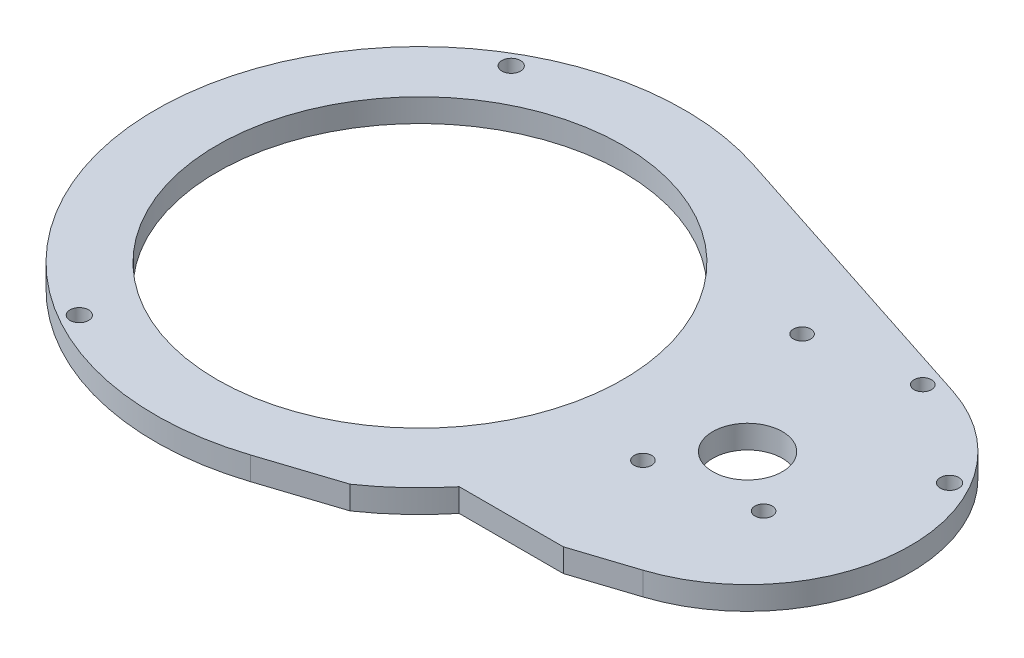
ISO-10303-21;
HEADER;
FILE_DESCRIPTION(('STEP AP214'),'2;1');
FILE_NAME('part.step','',(''),(''),'','','');
FILE_SCHEMA(('AUTOMOTIVE_DESIGN { 1 0 10303 214 1 1 1 1 }'));
ENDSEC;
DATA;
#1=APPLICATION_CONTEXT('core data for automotive mechanical design processes');
#2=APPLICATION_PROTOCOL_DEFINITION('international standard','automotive_design',2000,#1);
#3=PRODUCT_CONTEXT('',#1,'mechanical');
#4=PRODUCT('Part','Part','',(#3));
#5=PRODUCT_RELATED_PRODUCT_CATEGORY('part','',(#4));
#6=PRODUCT_DEFINITION_FORMATION('','',#4);
#7=PRODUCT_DEFINITION_CONTEXT('part definition',#1,'design');
#8=PRODUCT_DEFINITION('design','',#6,#7);
#9=PRODUCT_DEFINITION_SHAPE('','',#8);
#10=(LENGTH_UNIT() NAMED_UNIT(*) SI_UNIT(.MILLI.,.METRE.));
#11=(NAMED_UNIT(*) PLANE_ANGLE_UNIT() SI_UNIT($,.RADIAN.));
#12=(NAMED_UNIT(*) SI_UNIT($,.STERADIAN.) SOLID_ANGLE_UNIT());
#13=UNCERTAINTY_MEASURE_WITH_UNIT(LENGTH_MEASURE(1.E-05),#10,'distance_accuracy_value','');
#14=(GEOMETRIC_REPRESENTATION_CONTEXT(3) GLOBAL_UNCERTAINTY_ASSIGNED_CONTEXT((#13)) GLOBAL_UNIT_ASSIGNED_CONTEXT((#10,
#11,#12)) REPRESENTATION_CONTEXT('',''));
#15=CARTESIAN_POINT('',(0.,0.,0.));
#16=DIRECTION('',(0.,0.,1.));
#17=DIRECTION('',(1.,0.,0.));
#18=AXIS2_PLACEMENT_3D('',#15,#16,#17);
#19=CARTESIAN_POINT('',(14.1238938053097,4.,43.3575324917866));
#20=DIRECTION('',(-0.309734513274336,0.,-0.950823080960233));
#21=DIRECTION('',(-0.950823080960233,0.,0.309734513274336));
#22=AXIS2_PLACEMENT_3D('',#19,#20,#21);
#23=PLANE('',#22);
#24=DIRECTION('',(0.950823080960233,0.,-0.309734513274336));
#25=VECTOR('',#24,1.);
#26=CARTESIAN_POINT('',(14.1238938053097,0.,43.3575324917866));
#27=LINE('',#26,#25);
#28=CARTESIAN_POINT('',(54.8218701351415,0.,30.1));
#29=VERTEX_POINT('',#28);
#30=CARTESIAN_POINT('',(65.2035398230089,0.,26.7181285749825));
#31=VERTEX_POINT('',#30);
#32=EDGE_CURVE('E135',#29,#31,#27,.T.);
#33=ORIENTED_EDGE('',*,*,#32,.T.);
#34=DIRECTION('',(0.,-1.,0.));
#35=VECTOR('',#34,1.);
#36=CARTESIAN_POINT('',(65.2035398230089,4.,26.7181285749825));
#37=LINE('',#36,#35);
#38=CARTESIAN_POINT('',(65.2035398230089,4.,26.7181285749825));
#39=VERTEX_POINT('',#38);
#40=EDGE_CURVE('E11',#39,#31,#37,.T.);
#41=ORIENTED_EDGE('',*,*,#40,.F.);
#42=DIRECTION('',(0.950823080960233,0.,-0.309734513274336));
#43=VECTOR('',#42,1.);
#44=CARTESIAN_POINT('',(14.1238938053097,4.,43.3575324917866));
#45=LINE('',#44,#43);
#46=CARTESIAN_POINT('',(54.8218701351415,4.,30.1));
#47=VERTEX_POINT('',#46);
#48=EDGE_CURVE('E120',#47,#39,#45,.T.);
#49=ORIENTED_EDGE('',*,*,#48,.F.);
#50=DIRECTION('',(0.,-1.,0.));
#51=VECTOR('',#50,1.);
#52=CARTESIAN_POINT('',(54.8218701351415,4.,30.1));
#53=LINE('',#52,#51);
#54=EDGE_CURVE('E130',#47,#29,#53,.T.);
#55=ORIENTED_EDGE('',*,*,#54,.T.);
#56=EDGE_LOOP('',(#33,#41,#49,#55));
#57=FACE_BOUND('',#56,.T.);
#58=ADVANCED_FACE('F39',(#57),#23,.F.);
#59=CARTESIAN_POINT('',(56.5,4.,0.));
#60=DIRECTION('',(0.,-1.,0.));
#61=DIRECTION('',(0.,0.,-1.));
#62=AXIS2_PLACEMENT_3D('',#59,#60,#61);
#63=CYLINDRICAL_SURFACE('',#62,28.1);
#64=CARTESIAN_POINT('',(56.5,0.,0.));
#65=DIRECTION('',(0.,1.,0.));
#66=DIRECTION('',(0.,0.,1.));
#67=AXIS2_PLACEMENT_3D('',#64,#65,#66);
#68=CIRCLE('',#67,28.1);
#69=CARTESIAN_POINT('',(65.2035398230089,0.,-26.7181285749825));
#70=VERTEX_POINT('',#69);
#71=EDGE_CURVE('E138',#31,#70,#68,.T.);
#72=ORIENTED_EDGE('',*,*,#71,.T.);
#73=DIRECTION('',(0.,-1.,0.));
#74=VECTOR('',#73,1.);
#75=CARTESIAN_POINT('',(65.2035398230089,4.,-26.7181285749825));
#76=LINE('',#75,#74);
#77=CARTESIAN_POINT('',(65.2035398230089,4.,-26.7181285749825));
#78=VERTEX_POINT('',#77);
#79=EDGE_CURVE('E49',#78,#70,#76,.T.);
#80=ORIENTED_EDGE('',*,*,#79,.F.);
#81=CARTESIAN_POINT('',(56.5,4.,0.));
#82=DIRECTION('',(0.,1.,0.));
#83=DIRECTION('',(0.,0.,1.));
#84=AXIS2_PLACEMENT_3D('',#81,#82,#83);
#85=CIRCLE('',#84,28.1);
#86=EDGE_CURVE('E98',#39,#78,#85,.T.);
#87=ORIENTED_EDGE('',*,*,#86,.F.);
#88=ORIENTED_EDGE('',*,*,#40,.T.);
#89=EDGE_LOOP('',(#72,#80,#87,#88));
#90=FACE_BOUND('',#89,.T.);
#91=ADVANCED_FACE('F41',(#90),#63,.T.);
#92=CARTESIAN_POINT('',(14.1238938053097,4.,-43.3575324917866));
#93=DIRECTION('',(0.309734513274336,0.,-0.950823080960233));
#94=DIRECTION('',(-0.950823080960233,0.,-0.309734513274336));
#95=AXIS2_PLACEMENT_3D('',#92,#93,#94);
#96=PLANE('',#95);
#97=DIRECTION('',(0.950823080960233,0.,0.309734513274336));
#98=VECTOR('',#97,1.);
#99=CARTESIAN_POINT('',(14.1238938053097,0.,-43.3575324917866));
#100=LINE('',#99,#98);
#101=CARTESIAN_POINT('',(14.1238938053097,0.,-43.3575324917866));
#102=VERTEX_POINT('',#101);
#103=EDGE_CURVE('E142',#102,#70,#100,.T.);
#104=ORIENTED_EDGE('',*,*,#103,.F.);
#105=DIRECTION('',(0.,-1.,0.));
#106=VECTOR('',#105,1.);
#107=CARTESIAN_POINT('',(14.1238938053097,4.,-43.3575324917866));
#108=LINE('',#107,#106);
#109=CARTESIAN_POINT('',(14.1238938053097,4.,-43.3575324917866));
#110=VERTEX_POINT('',#109);
#111=EDGE_CURVE('E152',#110,#102,#108,.T.);
#112=ORIENTED_EDGE('',*,*,#111,.F.);
#113=DIRECTION('',(0.950823080960233,0.,0.309734513274336));
#114=VECTOR('',#113,1.);
#115=CARTESIAN_POINT('',(14.1238938053097,4.,-43.3575324917866));
#116=LINE('',#115,#114);
#117=EDGE_CURVE('E203',#110,#78,#116,.T.);
#118=ORIENTED_EDGE('',*,*,#117,.T.);
#119=ORIENTED_EDGE('',*,*,#79,.T.);
#120=EDGE_LOOP('',(#104,#112,#118,#119));
#121=FACE_BOUND('',#120,.T.);
#122=ADVANCED_FACE('F207',(#121),#96,.T.);
#123=CARTESIAN_POINT('',(0.,4.,0.));
#124=DIRECTION('',(0.,-1.,0.));
#125=DIRECTION('',(0.,0.,-1.));
#126=AXIS2_PLACEMENT_3D('',#123,#124,#125);
#127=CYLINDRICAL_SURFACE('',#126,45.6);
#128=CARTESIAN_POINT('',(0.,0.,0.));
#129=DIRECTION('',(0.,1.,0.));
#130=DIRECTION('',(0.,0.,1.));
#131=AXIS2_PLACEMENT_3D('',#128,#129,#130);
#132=CIRCLE('',#131,45.6);
#133=CARTESIAN_POINT('',(14.1238938053097,0.,43.3575324917866));
#134=VERTEX_POINT('',#133);
#135=EDGE_CURVE('E145',#102,#134,#132,.T.);
#136=ORIENTED_EDGE('',*,*,#135,.T.);
#137=DIRECTION('',(0.,-1.,0.));
#138=VECTOR('',#137,1.);
#139=CARTESIAN_POINT('',(14.1238938053097,4.,43.3575324917866));
#140=LINE('',#139,#138);
#141=CARTESIAN_POINT('',(14.1238938053097,4.,43.3575324917866));
#142=VERTEX_POINT('',#141);
#143=EDGE_CURVE('E125',#142,#134,#140,.T.);
#144=ORIENTED_EDGE('',*,*,#143,.F.);
#145=CARTESIAN_POINT('',(0.,4.,0.));
#146=DIRECTION('',(0.,1.,0.));
#147=DIRECTION('',(0.,0.,1.));
#148=AXIS2_PLACEMENT_3D('',#145,#146,#147);
#149=CIRCLE('',#148,45.6);
#150=EDGE_CURVE('E115',#110,#142,#149,.T.);
#151=ORIENTED_EDGE('',*,*,#150,.F.);
#152=ORIENTED_EDGE('',*,*,#111,.T.);
#153=EDGE_LOOP('',(#136,#144,#151,#152));
#154=FACE_BOUND('',#153,.T.);
#155=ADVANCED_FACE('F215',(#154),#127,.T.);
#156=CARTESIAN_POINT('',(27.105327802825,0.,39.1287771940474));
#157=VERTEX_POINT('',#156);
#158=EDGE_CURVE('E124',#134,#157,#27,.T.);
#159=ORIENTED_EDGE('',*,*,#158,.T.);
#160=DIRECTION('',(0.,-1.,0.));
#161=VECTOR('',#160,1.);
#162=CARTESIAN_POINT('',(27.105327802825,4.,39.1287771940474));
#163=LINE('',#162,#161);
#164=CARTESIAN_POINT('',(27.105327802825,4.,39.1287771940474));
#165=VERTEX_POINT('',#164);
#166=EDGE_CURVE('E121',#165,#157,#163,.T.);
#167=ORIENTED_EDGE('',*,*,#166,.F.);
#168=EDGE_CURVE('E108',#142,#165,#45,.T.);
#169=ORIENTED_EDGE('',*,*,#168,.F.);
#170=ORIENTED_EDGE('',*,*,#143,.T.);
#171=EDGE_LOOP('',(#159,#167,#169,#170));
#172=FACE_BOUND('',#171,.T.);
#173=ADVANCED_FACE('F122',(#172),#23,.F.);
#174=CARTESIAN_POINT('',(0.,4.,0.));
#175=DIRECTION('',(0.,-1.,0.));
#176=DIRECTION('',(0.,0.,-1.));
#177=AXIS2_PLACEMENT_3D('',#174,#175,#176);
#178=CYLINDRICAL_SURFACE('',#177,47.6);
#179=CARTESIAN_POINT('',(0.,0.,0.));
#180=DIRECTION('',(0.,1.,0.));
#181=DIRECTION('',(0.,0.,1.));
#182=AXIS2_PLACEMENT_3D('',#179,#180,#181);
#183=CIRCLE('',#182,47.6);
#184=CARTESIAN_POINT('',(36.8747881349846,0.,30.1));
#185=VERTEX_POINT('',#184);
#186=EDGE_CURVE('E84',#157,#185,#183,.T.);
#187=ORIENTED_EDGE('',*,*,#186,.T.);
#188=DIRECTION('',(0.,-1.,0.));
#189=VECTOR('',#188,1.);
#190=CARTESIAN_POINT('',(36.8747881349846,4.,30.1));
#191=LINE('',#190,#189);
#192=CARTESIAN_POINT('',(36.8747881349846,4.,30.1));
#193=VERTEX_POINT('',#192);
#194=EDGE_CURVE('E126',#193,#185,#191,.T.);
#195=ORIENTED_EDGE('',*,*,#194,.F.);
#196=CARTESIAN_POINT('',(0.,4.,0.));
#197=DIRECTION('',(0.,1.,0.));
#198=DIRECTION('',(0.,0.,1.));
#199=AXIS2_PLACEMENT_3D('',#196,#197,#198);
#200=CIRCLE('',#199,47.6);
#201=EDGE_CURVE('E112',#165,#193,#200,.T.);
#202=ORIENTED_EDGE('',*,*,#201,.F.);
#203=ORIENTED_EDGE('',*,*,#166,.T.);
#204=EDGE_LOOP('',(#187,#195,#202,#203));
#205=FACE_BOUND('',#204,.T.);
#206=ADVANCED_FACE('F128',(#205),#178,.T.);
#207=CARTESIAN_POINT('',(0.,4.,30.1));
#208=DIRECTION('',(0.,0.,-1.));
#209=DIRECTION('',(-1.,0.,0.));
#210=AXIS2_PLACEMENT_3D('',#207,#208,#209);
#211=PLANE('',#210);
#212=DIRECTION('',(1.,0.,0.));
#213=VECTOR('',#212,1.);
#214=CARTESIAN_POINT('',(0.,0.,30.1));
#215=LINE('',#214,#213);
#216=EDGE_CURVE('E90',#185,#29,#215,.T.);
#217=ORIENTED_EDGE('',*,*,#216,.T.);
#218=ORIENTED_EDGE('',*,*,#54,.F.);
#219=DIRECTION('',(1.,0.,0.));
#220=VECTOR('',#219,1.);
#221=CARTESIAN_POINT('',(0.,4.,30.1));
#222=LINE('',#221,#220);
#223=EDGE_CURVE('E58',#193,#47,#222,.T.);
#224=ORIENTED_EDGE('',*,*,#223,.F.);
#225=ORIENTED_EDGE('',*,*,#194,.T.);
#226=EDGE_LOOP('',(#217,#218,#224,#225));
#227=FACE_BOUND('',#226,.T.);
#228=ADVANCED_FACE('F231',(#227),#211,.F.);
#229=CARTESIAN_POINT('',(0.,4.,0.));
#230=DIRECTION('',(0.,1.,0.));
#231=DIRECTION('',(0.,0.,1.));
#232=AXIS2_PLACEMENT_3D('',#229,#230,#231);
#233=PLANE('',#232);
#234=CARTESIAN_POINT('',(66.758977016517,4.,7.49195017677568));
#235=DIRECTION('',(0.,1.,0.));
#236=DIRECTION('',(0.,0.,1.));
#237=AXIS2_PLACEMENT_3D('',#234,#235,#236);
#238=CIRCLE('',#237,1.5);
#239=CARTESIAN_POINT('',(66.758977016517,4.,8.99195017677568));
#240=VERTEX_POINT('',#239);
#241=EDGE_CURVE('E177',#240,#240,#238,.T.);
#242=ORIENTED_EDGE('',*,*,#241,.F.);
#243=EDGE_LOOP('',(#242));
#244=FACE_BOUND('',#243,.T.);
#245=CARTESIAN_POINT('',(48.7816000672357,4.,10.3298927455128));
#246=DIRECTION('',(0.,1.,0.));
#247=DIRECTION('',(0.,0.,1.));
#248=AXIS2_PLACEMENT_3D('',#245,#246,#247);
#249=CIRCLE('',#248,1.5);
#250=CARTESIAN_POINT('',(48.7816000672357,4.,11.8298927455129));
#251=VERTEX_POINT('',#250);
#252=EDGE_CURVE('E278',#251,#251,#249,.T.);
#253=ORIENTED_EDGE('',*,*,#252,.F.);
#254=EDGE_LOOP('',(#253));
#255=FACE_BOUND('',#254,.T.);
#256=CARTESIAN_POINT('',(61.6132569743012,4.,-25.1043926433497));
#257=DIRECTION('',(0.,1.,0.));
#258=DIRECTION('',(0.,0.,1.));
#259=AXIS2_PLACEMENT_3D('',#256,#257,#258);
#260=CIRCLE('',#259,1.49999999999999);
#261=CARTESIAN_POINT('',(61.6132569743012,4.,-23.6043926433497));
#262=VERTEX_POINT('',#261);
#263=EDGE_CURVE('E281',#262,#262,#260,.T.);
#264=ORIENTED_EDGE('',*,*,#263,.F.);
#265=EDGE_LOOP('',(#264));
#266=FACE_BOUND('',#265,.T.);
#267=CARTESIAN_POINT('',(43.63588002502,4.,-22.2664500746125));
#268=DIRECTION('',(0.,1.,0.));
#269=DIRECTION('',(0.,0.,1.));
#270=AXIS2_PLACEMENT_3D('',#267,#268,#269);
#271=CIRCLE('',#270,1.5);
#272=CARTESIAN_POINT('',(43.63588002502,4.,-20.7664500746125));
#273=VERTEX_POINT('',#272);
#274=EDGE_CURVE('E192',#273,#273,#271,.T.);
#275=ORIENTED_EDGE('',*,*,#274,.F.);
#276=EDGE_LOOP('',(#275));
#277=FACE_BOUND('',#276,.T.);
#278=CARTESIAN_POINT('',(0.,4.,0.));
#279=DIRECTION('',(0.,1.,0.));
#280=DIRECTION('',(0.,0.,1.));
#281=AXIS2_PLACEMENT_3D('',#278,#279,#280);
#282=CIRCLE('',#281,35.);
#283=CARTESIAN_POINT('',(0.,4.,35.));
#284=VERTEX_POINT('',#283);
#285=EDGE_CURVE('E172',#284,#284,#282,.T.);
#286=ORIENTED_EDGE('',*,*,#285,.F.);
#287=EDGE_LOOP('',(#286));
#288=FACE_BOUND('',#287,.T.);
#289=CARTESIAN_POINT('',(78.5836477965031,4.,-12.7500000000001));
#290=DIRECTION('',(0.,1.,0.));
#291=DIRECTION('',(0.,0.,1.));
#292=AXIS2_PLACEMENT_3D('',#289,#290,#291);
#293=CIRCLE('',#292,1.6);
#294=CARTESIAN_POINT('',(78.5836477965031,4.,-11.1500000000001));
#295=VERTEX_POINT('',#294);
#296=EDGE_CURVE('E162',#295,#295,#293,.T.);
#297=ORIENTED_EDGE('',*,*,#296,.F.);
#298=EDGE_LOOP('',(#297));
#299=FACE_BOUND('',#298,.T.);
#300=CARTESIAN_POINT('',(-21.5000000000001,4.,-37.2390923627309));
#301=DIRECTION('',(0.,1.,0.));
#302=DIRECTION('',(0.,0.,1.));
#303=AXIS2_PLACEMENT_3D('',#300,#301,#302);
#304=CIRCLE('',#303,1.6);
#305=CARTESIAN_POINT('',(-21.5000000000001,4.,-35.6390923627309));
#306=VERTEX_POINT('',#305);
#307=EDGE_CURVE('E196',#306,#306,#304,.T.);
#308=ORIENTED_EDGE('',*,*,#307,.F.);
#309=EDGE_LOOP('',(#308));
#310=FACE_BOUND('',#309,.T.);
#311=CARTESIAN_POINT('',(-21.4999999999999,4.,37.2390923627309));
#312=DIRECTION('',(0.,1.,0.));
#313=DIRECTION('',(0.,0.,1.));
#314=AXIS2_PLACEMENT_3D('',#311,#312,#313);
#315=CIRCLE('',#314,1.60000000000001);
#316=CARTESIAN_POINT('',(-21.4999999999999,4.,38.8390923627309));
#317=VERTEX_POINT('',#316);
#318=EDGE_CURVE('E171',#317,#317,#315,.T.);
#319=ORIENTED_EDGE('',*,*,#318,.F.);
#320=EDGE_LOOP('',(#319));
#321=FACE_BOUND('',#320,.T.);
#322=CARTESIAN_POINT('',(56.5,4.,0.));
#323=DIRECTION('',(0.,1.,0.));
#324=DIRECTION('',(0.,0.,1.));
#325=AXIS2_PLACEMENT_3D('',#322,#323,#324);
#326=CIRCLE('',#325,6.00000000000005);
#327=CARTESIAN_POINT('',(56.5,4.,6.00000000000007));
#328=VERTEX_POINT('',#327);
#329=EDGE_CURVE('E157',#328,#328,#326,.T.);
#330=ORIENTED_EDGE('',*,*,#329,.F.);
#331=EDGE_LOOP('',(#330));
#332=FACE_BOUND('',#331,.T.);
#333=ORIENTED_EDGE('',*,*,#48,.T.);
#334=ORIENTED_EDGE('',*,*,#86,.T.);
#335=ORIENTED_EDGE('',*,*,#117,.F.);
#336=ORIENTED_EDGE('',*,*,#150,.T.);
#337=ORIENTED_EDGE('',*,*,#168,.T.);
#338=ORIENTED_EDGE('',*,*,#201,.T.);
#339=ORIENTED_EDGE('',*,*,#223,.T.);
#340=EDGE_LOOP('',(#333,#334,#335,#336,#337,#338,#339));
#341=FACE_BOUND('',#340,.T.);
#342=ADVANCED_FACE('F110',(#244,#255,#266,#277,#288,#299,#310,#321,#332,#341),#233,.T.);
#343=CARTESIAN_POINT('',(0.,0.,0.));
#344=DIRECTION('',(0.,1.,0.));
#345=DIRECTION('',(0.,0.,1.));
#346=AXIS2_PLACEMENT_3D('',#343,#344,#345);
#347=PLANE('',#346);
#348=CARTESIAN_POINT('',(66.758977016517,0.,7.49195017677568));
#349=DIRECTION('',(0.,1.,0.));
#350=DIRECTION('',(0.,0.,1.));
#351=AXIS2_PLACEMENT_3D('',#348,#349,#350);
#352=CIRCLE('',#351,1.5);
#353=CARTESIAN_POINT('',(66.758977016517,0.,8.99195017677568));
#354=VERTEX_POINT('',#353);
#355=EDGE_CURVE('E43',#354,#354,#352,.T.);
#356=ORIENTED_EDGE('',*,*,#355,.T.);
#357=EDGE_LOOP('',(#356));
#358=FACE_BOUND('',#357,.T.);
#359=CARTESIAN_POINT('',(48.7816000672357,0.,10.3298927455128));
#360=DIRECTION('',(0.,1.,0.));
#361=DIRECTION('',(0.,0.,1.));
#362=AXIS2_PLACEMENT_3D('',#359,#360,#361);
#363=CIRCLE('',#362,1.5);
#364=CARTESIAN_POINT('',(48.7816000672357,0.,11.8298927455129));
#365=VERTEX_POINT('',#364);
#366=EDGE_CURVE('E179',#365,#365,#363,.T.);
#367=ORIENTED_EDGE('',*,*,#366,.T.);
#368=EDGE_LOOP('',(#367));
#369=FACE_BOUND('',#368,.T.);
#370=CARTESIAN_POINT('',(61.6132569743012,0.,-25.1043926433497));
#371=DIRECTION('',(0.,1.,0.));
#372=DIRECTION('',(0.,0.,1.));
#373=AXIS2_PLACEMENT_3D('',#370,#371,#372);
#374=CIRCLE('',#373,1.49999999999999);
#375=CARTESIAN_POINT('',(61.6132569743012,0.,-23.6043926433497));
#376=VERTEX_POINT('',#375);
#377=EDGE_CURVE('E176',#376,#376,#374,.T.);
#378=ORIENTED_EDGE('',*,*,#377,.T.);
#379=EDGE_LOOP('',(#378));
#380=FACE_BOUND('',#379,.T.);
#381=CARTESIAN_POINT('',(43.63588002502,0.,-22.2664500746125));
#382=DIRECTION('',(0.,1.,0.));
#383=DIRECTION('',(0.,0.,1.));
#384=AXIS2_PLACEMENT_3D('',#381,#382,#383);
#385=CIRCLE('',#384,1.5);
#386=CARTESIAN_POINT('',(43.63588002502,0.,-20.7664500746125));
#387=VERTEX_POINT('',#386);
#388=EDGE_CURVE('E173',#387,#387,#385,.T.);
#389=ORIENTED_EDGE('',*,*,#388,.T.);
#390=EDGE_LOOP('',(#389));
#391=FACE_BOUND('',#390,.T.);
#392=CARTESIAN_POINT('',(0.,0.,0.));
#393=DIRECTION('',(0.,1.,0.));
#394=DIRECTION('',(0.,0.,1.));
#395=AXIS2_PLACEMENT_3D('',#392,#393,#394);
#396=CIRCLE('',#395,35.);
#397=CARTESIAN_POINT('',(0.,0.,35.));
#398=VERTEX_POINT('',#397);
#399=EDGE_CURVE('E168',#398,#398,#396,.T.);
#400=ORIENTED_EDGE('',*,*,#399,.T.);
#401=EDGE_LOOP('',(#400));
#402=FACE_BOUND('',#401,.T.);
#403=CARTESIAN_POINT('',(78.5836477965031,0.,-12.7500000000001));
#404=DIRECTION('',(0.,1.,0.));
#405=DIRECTION('',(0.,0.,1.));
#406=AXIS2_PLACEMENT_3D('',#403,#404,#405);
#407=CIRCLE('',#406,1.6);
#408=CARTESIAN_POINT('',(78.5836477965031,0.,-11.1500000000001));
#409=VERTEX_POINT('',#408);
#410=EDGE_CURVE('E165',#409,#409,#407,.T.);
#411=ORIENTED_EDGE('',*,*,#410,.T.);
#412=EDGE_LOOP('',(#411));
#413=FACE_BOUND('',#412,.T.);
#414=CARTESIAN_POINT('',(-21.5000000000001,0.,-37.2390923627309));
#415=DIRECTION('',(0.,1.,0.));
#416=DIRECTION('',(0.,0.,1.));
#417=AXIS2_PLACEMENT_3D('',#414,#415,#416);
#418=CIRCLE('',#417,1.6);
#419=CARTESIAN_POINT('',(-21.5000000000001,0.,-35.6390923627309));
#420=VERTEX_POINT('',#419);
#421=EDGE_CURVE('E161',#420,#420,#418,.T.);
#422=ORIENTED_EDGE('',*,*,#421,.T.);
#423=EDGE_LOOP('',(#422));
#424=FACE_BOUND('',#423,.T.);
#425=CARTESIAN_POINT('',(-21.4999999999999,0.,37.2390923627309));
#426=DIRECTION('',(0.,1.,0.));
#427=DIRECTION('',(0.,0.,1.));
#428=AXIS2_PLACEMENT_3D('',#425,#426,#427);
#429=CIRCLE('',#428,1.60000000000001);
#430=CARTESIAN_POINT('',(-21.4999999999999,0.,38.8390923627309));
#431=VERTEX_POINT('',#430);
#432=EDGE_CURVE('E158',#431,#431,#429,.T.);
#433=ORIENTED_EDGE('',*,*,#432,.T.);
#434=EDGE_LOOP('',(#433));
#435=FACE_BOUND('',#434,.T.);
#436=CARTESIAN_POINT('',(56.5,0.,0.));
#437=DIRECTION('',(0.,1.,0.));
#438=DIRECTION('',(0.,0.,1.));
#439=AXIS2_PLACEMENT_3D('',#436,#437,#438);
#440=CIRCLE('',#439,6.00000000000005);
#441=CARTESIAN_POINT('',(56.5,0.,6.00000000000007));
#442=VERTEX_POINT('',#441);
#443=EDGE_CURVE('E139',#442,#442,#440,.T.);
#444=ORIENTED_EDGE('',*,*,#443,.T.);
#445=EDGE_LOOP('',(#444));
#446=FACE_BOUND('',#445,.T.);
#447=ORIENTED_EDGE('',*,*,#32,.F.);
#448=ORIENTED_EDGE('',*,*,#216,.F.);
#449=ORIENTED_EDGE('',*,*,#186,.F.);
#450=ORIENTED_EDGE('',*,*,#158,.F.);
#451=ORIENTED_EDGE('',*,*,#135,.F.);
#452=ORIENTED_EDGE('',*,*,#103,.T.);
#453=ORIENTED_EDGE('',*,*,#71,.F.);
#454=EDGE_LOOP('',(#447,#448,#449,#450,#451,#452,#453));
#455=FACE_BOUND('',#454,.T.);
#456=ADVANCED_FACE('F213',(#358,#369,#380,#391,#402,#413,#424,#435,#446,#455),#347,.F.);
#457=CARTESIAN_POINT('',(56.5,-6.,0.));
#458=DIRECTION('',(0.,1.,0.));
#459=DIRECTION('',(0.,0.,1.));
#460=AXIS2_PLACEMENT_3D('',#457,#458,#459);
#461=CYLINDRICAL_SURFACE('',#460,6.00000000000005);
#462=ORIENTED_EDGE('',*,*,#329,.T.);
#463=EDGE_LOOP('',(#462));
#464=FACE_BOUND('',#463,.T.);
#465=ORIENTED_EDGE('',*,*,#443,.F.);
#466=EDGE_LOOP('',(#465));
#467=FACE_BOUND('',#466,.T.);
#468=ADVANCED_FACE('F236',(#464,#467),#461,.F.);
#469=CARTESIAN_POINT('',(-21.4999999999999,-6.,37.2390923627309));
#470=DIRECTION('',(0.,1.,0.));
#471=DIRECTION('',(0.,0.,1.));
#472=AXIS2_PLACEMENT_3D('',#469,#470,#471);
#473=CYLINDRICAL_SURFACE('',#472,1.60000000000001);
#474=ORIENTED_EDGE('',*,*,#318,.T.);
#475=EDGE_LOOP('',(#474));
#476=FACE_BOUND('',#475,.T.);
#477=ORIENTED_EDGE('',*,*,#432,.F.);
#478=EDGE_LOOP('',(#477));
#479=FACE_BOUND('',#478,.T.);
#480=ADVANCED_FACE('F242',(#476,#479),#473,.F.);
#481=CARTESIAN_POINT('',(-21.5000000000001,-6.,-37.2390923627309));
#482=DIRECTION('',(0.,1.,0.));
#483=DIRECTION('',(0.,0.,1.));
#484=AXIS2_PLACEMENT_3D('',#481,#482,#483);
#485=CYLINDRICAL_SURFACE('',#484,1.6);
#486=ORIENTED_EDGE('',*,*,#307,.T.);
#487=EDGE_LOOP('',(#486));
#488=FACE_BOUND('',#487,.T.);
#489=ORIENTED_EDGE('',*,*,#421,.F.);
#490=EDGE_LOOP('',(#489));
#491=FACE_BOUND('',#490,.T.);
#492=ADVANCED_FACE('F246',(#488,#491),#485,.F.);
#493=CARTESIAN_POINT('',(78.5836477965031,-6.,-12.7500000000001));
#494=DIRECTION('',(0.,1.,0.));
#495=DIRECTION('',(0.,0.,1.));
#496=AXIS2_PLACEMENT_3D('',#493,#494,#495);
#497=CYLINDRICAL_SURFACE('',#496,1.6);
#498=ORIENTED_EDGE('',*,*,#296,.T.);
#499=EDGE_LOOP('',(#498));
#500=FACE_BOUND('',#499,.T.);
#501=ORIENTED_EDGE('',*,*,#410,.F.);
#502=EDGE_LOOP('',(#501));
#503=FACE_BOUND('',#502,.T.);
#504=ADVANCED_FACE('F250',(#500,#503),#497,.F.);
#505=CARTESIAN_POINT('',(0.,-6.,0.));
#506=DIRECTION('',(0.,1.,0.));
#507=DIRECTION('',(0.,0.,1.));
#508=AXIS2_PLACEMENT_3D('',#505,#506,#507);
#509=CYLINDRICAL_SURFACE('',#508,35.);
#510=ORIENTED_EDGE('',*,*,#285,.T.);
#511=EDGE_LOOP('',(#510));
#512=FACE_BOUND('',#511,.T.);
#513=ORIENTED_EDGE('',*,*,#399,.F.);
#514=EDGE_LOOP('',(#513));
#515=FACE_BOUND('',#514,.T.);
#516=ADVANCED_FACE('F254',(#512,#515),#509,.F.);
#517=CARTESIAN_POINT('',(43.63588002502,-6.,-22.2664500746125));
#518=DIRECTION('',(0.,1.,0.));
#519=DIRECTION('',(0.,0.,1.));
#520=AXIS2_PLACEMENT_3D('',#517,#518,#519);
#521=CYLINDRICAL_SURFACE('',#520,1.5);
#522=ORIENTED_EDGE('',*,*,#274,.T.);
#523=EDGE_LOOP('',(#522));
#524=FACE_BOUND('',#523,.T.);
#525=ORIENTED_EDGE('',*,*,#388,.F.);
#526=EDGE_LOOP('',(#525));
#527=FACE_BOUND('',#526,.T.);
#528=ADVANCED_FACE('F258',(#524,#527),#521,.F.);
#529=CARTESIAN_POINT('',(61.6132569743012,-6.,-25.1043926433497));
#530=DIRECTION('',(0.,1.,0.));
#531=DIRECTION('',(0.,0.,1.));
#532=AXIS2_PLACEMENT_3D('',#529,#530,#531);
#533=CYLINDRICAL_SURFACE('',#532,1.49999999999999);
#534=ORIENTED_EDGE('',*,*,#263,.T.);
#535=EDGE_LOOP('',(#534));
#536=FACE_BOUND('',#535,.T.);
#537=ORIENTED_EDGE('',*,*,#377,.F.);
#538=EDGE_LOOP('',(#537));
#539=FACE_BOUND('',#538,.T.);
#540=ADVANCED_FACE('F261',(#536,#539),#533,.F.);
#541=CARTESIAN_POINT('',(48.7816000672357,-6.,10.3298927455128));
#542=DIRECTION('',(0.,1.,0.));
#543=DIRECTION('',(0.,0.,1.));
#544=AXIS2_PLACEMENT_3D('',#541,#542,#543);
#545=CYLINDRICAL_SURFACE('',#544,1.5);
#546=ORIENTED_EDGE('',*,*,#252,.T.);
#547=EDGE_LOOP('',(#546));
#548=FACE_BOUND('',#547,.T.);
#549=ORIENTED_EDGE('',*,*,#366,.F.);
#550=EDGE_LOOP('',(#549));
#551=FACE_BOUND('',#550,.T.);
#552=ADVANCED_FACE('F265',(#548,#551),#545,.F.);
#553=CARTESIAN_POINT('',(66.758977016517,-6.,7.49195017677568));
#554=DIRECTION('',(0.,1.,0.));
#555=DIRECTION('',(0.,0.,1.));
#556=AXIS2_PLACEMENT_3D('',#553,#554,#555);
#557=CYLINDRICAL_SURFACE('',#556,1.5);
#558=ORIENTED_EDGE('',*,*,#241,.T.);
#559=EDGE_LOOP('',(#558));
#560=FACE_BOUND('',#559,.T.);
#561=ORIENTED_EDGE('',*,*,#355,.F.);
#562=EDGE_LOOP('',(#561));
#563=FACE_BOUND('',#562,.T.);
#564=ADVANCED_FACE('F269',(#560,#563),#557,.F.);
#565=CLOSED_SHELL('',(#58,#91,#122,#155,#173,#206,#228,#342,#456,#468,#480,#492,#504,#516,#528,
#540,#552,#564));
#566=MANIFOLD_SOLID_BREP('B2',#565);
#567=ADVANCED_BREP_SHAPE_REPRESENTATION('',(#18,#566),#14);
#568=SHAPE_DEFINITION_REPRESENTATION(#9,#567);
ENDSEC;
END-ISO-10303-21;
